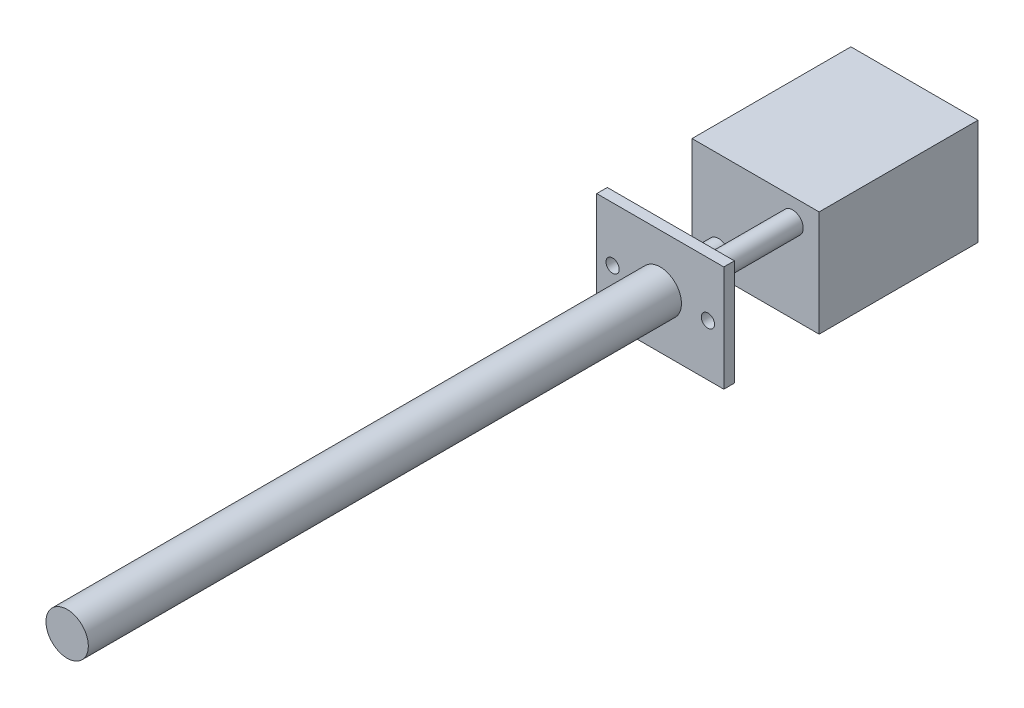
ISO-10303-21;
HEADER;
FILE_DESCRIPTION(('STEP AP214'),'2;1');
FILE_NAME('part.step','',(''),(''),'','','');
FILE_SCHEMA(('AUTOMOTIVE_DESIGN { 1 0 10303 214 1 1 1 1 }'));
ENDSEC;
DATA;
#1=APPLICATION_CONTEXT('core data for automotive mechanical design processes');
#2=APPLICATION_PROTOCOL_DEFINITION('international standard','automotive_design',2000,#1);
#3=PRODUCT_CONTEXT('',#1,'mechanical');
#4=PRODUCT('Part','Part','',(#3));
#5=PRODUCT_RELATED_PRODUCT_CATEGORY('part','',(#4));
#6=PRODUCT_DEFINITION_FORMATION('','',#4);
#7=PRODUCT_DEFINITION_CONTEXT('part definition',#1,'design');
#8=PRODUCT_DEFINITION('design','',#6,#7);
#9=PRODUCT_DEFINITION_SHAPE('','',#8);
#10=(LENGTH_UNIT() NAMED_UNIT(*) SI_UNIT(.MILLI.,.METRE.));
#11=(NAMED_UNIT(*) PLANE_ANGLE_UNIT() SI_UNIT($,.RADIAN.));
#12=(NAMED_UNIT(*) SI_UNIT($,.STERADIAN.) SOLID_ANGLE_UNIT());
#13=UNCERTAINTY_MEASURE_WITH_UNIT(LENGTH_MEASURE(1.E-05),#10,'distance_accuracy_value','');
#14=(GEOMETRIC_REPRESENTATION_CONTEXT(3) GLOBAL_UNCERTAINTY_ASSIGNED_CONTEXT((#13)) GLOBAL_UNIT_ASSIGNED_CONTEXT((#10,
#11,#12)) REPRESENTATION_CONTEXT('',''));
#15=CARTESIAN_POINT('',(0.,0.,0.));
#16=DIRECTION('',(0.,0.,1.));
#17=DIRECTION('',(1.,0.,0.));
#18=AXIS2_PLACEMENT_3D('',#15,#16,#17);
#19=CARTESIAN_POINT('',(6.,-5.,-15.));
#20=DIRECTION('',(1.,0.,0.));
#21=DIRECTION('',(0.,0.,-1.));
#22=AXIS2_PLACEMENT_3D('',#19,#20,#21);
#23=PLANE('',#22);
#24=DIRECTION('',(0.,1.,0.));
#25=VECTOR('',#24,1.);
#26=CARTESIAN_POINT('',(6.,-5.,0.));
#27=LINE('',#26,#25);
#28=CARTESIAN_POINT('',(6.,-5.,0.));
#29=VERTEX_POINT('',#28);
#30=CARTESIAN_POINT('',(6.,5.,0.));
#31=VERTEX_POINT('',#30);
#32=EDGE_CURVE('E168',#29,#31,#27,.T.);
#33=ORIENTED_EDGE('',*,*,#32,.F.);
#34=DIRECTION('',(0.,0.,1.));
#35=VECTOR('',#34,1.);
#36=CARTESIAN_POINT('',(6.,-5.,-15.));
#37=LINE('',#36,#35);
#38=CARTESIAN_POINT('',(6.,-5.,-15.));
#39=VERTEX_POINT('',#38);
#40=EDGE_CURVE('E61',#39,#29,#37,.T.);
#41=ORIENTED_EDGE('',*,*,#40,.F.);
#42=DIRECTION('',(0.,1.,0.));
#43=VECTOR('',#42,1.);
#44=CARTESIAN_POINT('',(6.,-5.,-15.));
#45=LINE('',#44,#43);
#46=CARTESIAN_POINT('',(6.,5.,-15.));
#47=VERTEX_POINT('',#46);
#48=EDGE_CURVE('E169',#39,#47,#45,.T.);
#49=ORIENTED_EDGE('',*,*,#48,.T.);
#50=DIRECTION('',(0.,0.,1.));
#51=VECTOR('',#50,1.);
#52=CARTESIAN_POINT('',(6.,5.,-15.));
#53=LINE('',#52,#51);
#54=EDGE_CURVE('E90',#47,#31,#53,.T.);
#55=ORIENTED_EDGE('',*,*,#54,.T.);
#56=EDGE_LOOP('',(#33,#41,#49,#55));
#57=FACE_BOUND('',#56,.T.);
#58=ADVANCED_FACE('F45',(#57),#23,.T.);
#59=CARTESIAN_POINT('',(-6.,-5.,-15.));
#60=DIRECTION('',(0.,-1.,0.));
#61=DIRECTION('',(0.,0.,-1.));
#62=AXIS2_PLACEMENT_3D('',#59,#60,#61);
#63=PLANE('',#62);
#64=DIRECTION('',(1.,0.,0.));
#65=VECTOR('',#64,1.);
#66=CARTESIAN_POINT('',(-6.,-5.,0.));
#67=LINE('',#66,#65);
#68=CARTESIAN_POINT('',(-6.,-5.,0.));
#69=VERTEX_POINT('',#68);
#70=EDGE_CURVE('E172',#69,#29,#67,.T.);
#71=ORIENTED_EDGE('',*,*,#70,.F.);
#72=DIRECTION('',(0.,0.,1.));
#73=VECTOR('',#72,1.);
#74=CARTESIAN_POINT('',(-6.,-5.,-15.));
#75=LINE('',#74,#73);
#76=CARTESIAN_POINT('',(-6.,-5.,-15.));
#77=VERTEX_POINT('',#76);
#78=EDGE_CURVE('E79',#77,#69,#75,.T.);
#79=ORIENTED_EDGE('',*,*,#78,.F.);
#80=DIRECTION('',(1.,0.,0.));
#81=VECTOR('',#80,1.);
#82=CARTESIAN_POINT('',(-6.,-5.,-15.));
#83=LINE('',#82,#81);
#84=EDGE_CURVE('E176',#77,#39,#83,.T.);
#85=ORIENTED_EDGE('',*,*,#84,.T.);
#86=ORIENTED_EDGE('',*,*,#40,.T.);
#87=EDGE_LOOP('',(#71,#79,#85,#86));
#88=FACE_BOUND('',#87,.T.);
#89=ADVANCED_FACE('F205',(#88),#63,.T.);
#90=CARTESIAN_POINT('',(-6.,-5.,-15.));
#91=DIRECTION('',(-1.,0.,0.));
#92=DIRECTION('',(0.,0.,1.));
#93=AXIS2_PLACEMENT_3D('',#90,#91,#92);
#94=PLANE('',#93);
#95=DIRECTION('',(0.,-1.,0.));
#96=VECTOR('',#95,1.);
#97=CARTESIAN_POINT('',(-6.,-5.,0.));
#98=LINE('',#97,#96);
#99=CARTESIAN_POINT('',(-6.,5.,0.));
#100=VERTEX_POINT('',#99);
#101=EDGE_CURVE('E183',#100,#69,#98,.T.);
#102=ORIENTED_EDGE('',*,*,#101,.F.);
#103=DIRECTION('',(0.,0.,1.));
#104=VECTOR('',#103,1.);
#105=CARTESIAN_POINT('',(-6.,5.,-15.));
#106=LINE('',#105,#104);
#107=CARTESIAN_POINT('',(-6.,5.,-15.));
#108=VERTEX_POINT('',#107);
#109=EDGE_CURVE('E189',#108,#100,#106,.T.);
#110=ORIENTED_EDGE('',*,*,#109,.F.);
#111=DIRECTION('',(0.,-1.,0.));
#112=VECTOR('',#111,1.);
#113=CARTESIAN_POINT('',(-6.,-5.,-15.));
#114=LINE('',#113,#112);
#115=EDGE_CURVE('E174',#108,#77,#114,.T.);
#116=ORIENTED_EDGE('',*,*,#115,.T.);
#117=ORIENTED_EDGE('',*,*,#78,.T.);
#118=EDGE_LOOP('',(#102,#110,#116,#117));
#119=FACE_BOUND('',#118,.T.);
#120=ADVANCED_FACE('F204',(#119),#94,.T.);
#121=CARTESIAN_POINT('',(-6.,5.,-15.));
#122=DIRECTION('',(0.,1.,0.));
#123=DIRECTION('',(0.,0.,1.));
#124=AXIS2_PLACEMENT_3D('',#121,#122,#123);
#125=PLANE('',#124);
#126=DIRECTION('',(-1.,0.,0.));
#127=VECTOR('',#126,1.);
#128=CARTESIAN_POINT('',(-6.,5.,0.));
#129=LINE('',#128,#127);
#130=EDGE_CURVE('E180',#31,#100,#129,.T.);
#131=ORIENTED_EDGE('',*,*,#130,.F.);
#132=ORIENTED_EDGE('',*,*,#54,.F.);
#133=DIRECTION('',(-1.,0.,0.));
#134=VECTOR('',#133,1.);
#135=CARTESIAN_POINT('',(-6.,5.,-15.));
#136=LINE('',#135,#134);
#137=EDGE_CURVE('E171',#47,#108,#136,.T.);
#138=ORIENTED_EDGE('',*,*,#137,.T.);
#139=ORIENTED_EDGE('',*,*,#109,.T.);
#140=EDGE_LOOP('',(#131,#132,#138,#139));
#141=FACE_BOUND('',#140,.T.);
#142=ADVANCED_FACE('F202',(#141),#125,.T.);
#143=CARTESIAN_POINT('',(0.,0.,-15.));
#144=DIRECTION('',(0.,0.,-1.));
#145=DIRECTION('',(-1.,0.,0.));
#146=AXIS2_PLACEMENT_3D('',#143,#144,#145);
#147=PLANE('',#146);
#148=ORIENTED_EDGE('',*,*,#48,.F.);
#149=ORIENTED_EDGE('',*,*,#84,.F.);
#150=ORIENTED_EDGE('',*,*,#115,.F.);
#151=ORIENTED_EDGE('',*,*,#137,.F.);
#152=EDGE_LOOP('',(#148,#149,#150,#151));
#153=FACE_BOUND('',#152,.T.);
#154=ADVANCED_FACE('F199',(#153),#147,.T.);
#155=CARTESIAN_POINT('',(0.,0.,0.));
#156=DIRECTION('',(0.,0.,-1.));
#157=DIRECTION('',(-1.,0.,0.));
#158=AXIS2_PLACEMENT_3D('',#155,#156,#157);
#159=PLANE('',#158);
#160=CARTESIAN_POINT('',(-3.5,-2.91666666666667,0.));
#161=DIRECTION('',(0.,0.,-1.));
#162=DIRECTION('',(-1.,0.,0.));
#163=AXIS2_PLACEMENT_3D('',#160,#161,#162);
#164=CIRCLE('',#163,0.999999999999999);
#165=CARTESIAN_POINT('',(-4.5,-2.91666666666667,0.));
#166=VERTEX_POINT('',#165);
#167=EDGE_CURVE('E11',#166,#166,#164,.F.);
#168=ORIENTED_EDGE('',*,*,#167,.F.);
#169=EDGE_LOOP('',(#168));
#170=FACE_BOUND('',#169,.T.);
#171=CARTESIAN_POINT('',(3.5,2.91666666666667,0.));
#172=DIRECTION('',(0.,0.,-1.));
#173=DIRECTION('',(-1.,0.,0.));
#174=AXIS2_PLACEMENT_3D('',#171,#172,#173);
#175=CIRCLE('',#174,1.);
#176=CARTESIAN_POINT('',(2.5,2.91666666666667,0.));
#177=VERTEX_POINT('',#176);
#178=EDGE_CURVE('E53',#177,#177,#175,.F.);
#179=ORIENTED_EDGE('',*,*,#178,.F.);
#180=EDGE_LOOP('',(#179));
#181=FACE_BOUND('',#180,.T.);
#182=ORIENTED_EDGE('',*,*,#32,.T.);
#183=ORIENTED_EDGE('',*,*,#130,.T.);
#184=ORIENTED_EDGE('',*,*,#101,.T.);
#185=ORIENTED_EDGE('',*,*,#70,.T.);
#186=EDGE_LOOP('',(#182,#183,#184,#185));
#187=FACE_BOUND('',#186,.T.);
#188=ADVANCED_FACE('F196',(#170,#181,#187),#159,.F.);
#189=CARTESIAN_POINT('',(3.5,2.91666666666667,-15.002));
#190=DIRECTION('',(0.,0.,1.));
#191=DIRECTION('',(1.,0.,0.));
#192=AXIS2_PLACEMENT_3D('',#189,#190,#191);
#193=CYLINDRICAL_SURFACE('',#192,1.);
#194=CARTESIAN_POINT('',(3.5,2.91666666666667,8.));
#195=DIRECTION('',(0.,0.,-1.));
#196=DIRECTION('',(-1.,0.,0.));
#197=AXIS2_PLACEMENT_3D('',#194,#195,#196);
#198=CIRCLE('',#197,1.);
#199=CARTESIAN_POINT('',(2.5,2.91666666666667,8.));
#200=VERTEX_POINT('',#199);
#201=EDGE_CURVE('E165',#200,#200,#198,.T.);
#202=ORIENTED_EDGE('',*,*,#201,.T.);
#203=EDGE_LOOP('',(#202));
#204=FACE_BOUND('',#203,.T.);
#205=ORIENTED_EDGE('',*,*,#178,.T.);
#206=EDGE_LOOP('',(#205));
#207=FACE_BOUND('',#206,.T.);
#208=ADVANCED_FACE('F194',(#204,#207),#193,.T.);
#209=CARTESIAN_POINT('',(6.,-5.,8.));
#210=DIRECTION('',(1.,0.,0.));
#211=DIRECTION('',(0.,0.,-1.));
#212=AXIS2_PLACEMENT_3D('',#209,#210,#211);
#213=PLANE('',#212);
#214=DIRECTION('',(0.,1.,0.));
#215=VECTOR('',#214,1.);
#216=CARTESIAN_POINT('',(6.,-5.,9.));
#217=LINE('',#216,#215);
#218=CARTESIAN_POINT('',(6.,-5.,9.));
#219=VERTEX_POINT('',#218);
#220=CARTESIAN_POINT('',(6.,5.,9.));
#221=VERTEX_POINT('',#220);
#222=EDGE_CURVE('E155',#219,#221,#217,.T.);
#223=ORIENTED_EDGE('',*,*,#222,.F.);
#224=DIRECTION('',(0.,0.,1.));
#225=VECTOR('',#224,1.);
#226=CARTESIAN_POINT('',(6.,-5.,8.));
#227=LINE('',#226,#225);
#228=CARTESIAN_POINT('',(6.,-5.,8.));
#229=VERTEX_POINT('',#228);
#230=EDGE_CURVE('E143',#229,#219,#227,.T.);
#231=ORIENTED_EDGE('',*,*,#230,.F.);
#232=DIRECTION('',(0.,1.,0.));
#233=VECTOR('',#232,1.);
#234=CARTESIAN_POINT('',(6.,-5.,8.));
#235=LINE('',#234,#233);
#236=CARTESIAN_POINT('',(6.,5.,8.));
#237=VERTEX_POINT('',#236);
#238=EDGE_CURVE('E137',#229,#237,#235,.T.);
#239=ORIENTED_EDGE('',*,*,#238,.T.);
#240=DIRECTION('',(0.,0.,1.));
#241=VECTOR('',#240,1.);
#242=CARTESIAN_POINT('',(6.,5.,8.));
#243=LINE('',#242,#241);
#244=EDGE_CURVE('E119',#237,#221,#243,.T.);
#245=ORIENTED_EDGE('',*,*,#244,.T.);
#246=EDGE_LOOP('',(#223,#231,#239,#245));
#247=FACE_BOUND('',#246,.T.);
#248=ADVANCED_FACE('F142',(#247),#213,.T.);
#249=CARTESIAN_POINT('',(-6.,-5.,8.));
#250=DIRECTION('',(0.,-1.,0.));
#251=DIRECTION('',(0.,0.,-1.));
#252=AXIS2_PLACEMENT_3D('',#249,#250,#251);
#253=PLANE('',#252);
#254=DIRECTION('',(1.,0.,0.));
#255=VECTOR('',#254,1.);
#256=CARTESIAN_POINT('',(-6.,-5.,9.));
#257=LINE('',#256,#255);
#258=CARTESIAN_POINT('',(-6.,-5.,9.));
#259=VERTEX_POINT('',#258);
#260=EDGE_CURVE('E144',#259,#219,#257,.T.);
#261=ORIENTED_EDGE('',*,*,#260,.F.);
#262=DIRECTION('',(0.,0.,1.));
#263=VECTOR('',#262,1.);
#264=CARTESIAN_POINT('',(-6.,-5.,8.));
#265=LINE('',#264,#263);
#266=CARTESIAN_POINT('',(-6.,-5.,8.));
#267=VERTEX_POINT('',#266);
#268=EDGE_CURVE('E162',#267,#259,#265,.T.);
#269=ORIENTED_EDGE('',*,*,#268,.F.);
#270=DIRECTION('',(1.,0.,0.));
#271=VECTOR('',#270,1.);
#272=CARTESIAN_POINT('',(-6.,-5.,8.));
#273=LINE('',#272,#271);
#274=EDGE_CURVE('E130',#267,#229,#273,.T.);
#275=ORIENTED_EDGE('',*,*,#274,.T.);
#276=ORIENTED_EDGE('',*,*,#230,.T.);
#277=EDGE_LOOP('',(#261,#269,#275,#276));
#278=FACE_BOUND('',#277,.T.);
#279=ADVANCED_FACE('F251',(#278),#253,.T.);
#280=CARTESIAN_POINT('',(-6.,-5.,8.));
#281=DIRECTION('',(-1.,0.,0.));
#282=DIRECTION('',(0.,0.,1.));
#283=AXIS2_PLACEMENT_3D('',#280,#281,#282);
#284=PLANE('',#283);
#285=DIRECTION('',(0.,-1.,0.));
#286=VECTOR('',#285,1.);
#287=CARTESIAN_POINT('',(-6.,-5.,9.));
#288=LINE('',#287,#286);
#289=CARTESIAN_POINT('',(-6.,5.,9.));
#290=VERTEX_POINT('',#289);
#291=EDGE_CURVE('E147',#290,#259,#288,.T.);
#292=ORIENTED_EDGE('',*,*,#291,.F.);
#293=DIRECTION('',(0.,0.,1.));
#294=VECTOR('',#293,1.);
#295=CARTESIAN_POINT('',(-6.,5.,8.));
#296=LINE('',#295,#294);
#297=CARTESIAN_POINT('',(-6.,5.,8.));
#298=VERTEX_POINT('',#297);
#299=EDGE_CURVE('E129',#298,#290,#296,.T.);
#300=ORIENTED_EDGE('',*,*,#299,.F.);
#301=DIRECTION('',(0.,-1.,0.));
#302=VECTOR('',#301,1.);
#303=CARTESIAN_POINT('',(-6.,-5.,8.));
#304=LINE('',#303,#302);
#305=EDGE_CURVE('E140',#298,#267,#304,.T.);
#306=ORIENTED_EDGE('',*,*,#305,.T.);
#307=ORIENTED_EDGE('',*,*,#268,.T.);
#308=EDGE_LOOP('',(#292,#300,#306,#307));
#309=FACE_BOUND('',#308,.T.);
#310=ADVANCED_FACE('F259',(#309),#284,.T.);
#311=CARTESIAN_POINT('',(-6.,5.,8.));
#312=DIRECTION('',(0.,1.,0.));
#313=DIRECTION('',(0.,0.,1.));
#314=AXIS2_PLACEMENT_3D('',#311,#312,#313);
#315=PLANE('',#314);
#316=DIRECTION('',(-1.,0.,0.));
#317=VECTOR('',#316,1.);
#318=CARTESIAN_POINT('',(-6.,5.,9.));
#319=LINE('',#318,#317);
#320=EDGE_CURVE('E124',#221,#290,#319,.T.);
#321=ORIENTED_EDGE('',*,*,#320,.F.);
#322=ORIENTED_EDGE('',*,*,#244,.F.);
#323=DIRECTION('',(-1.,0.,0.));
#324=VECTOR('',#323,1.);
#325=CARTESIAN_POINT('',(-6.,5.,8.));
#326=LINE('',#325,#324);
#327=EDGE_CURVE('E122',#237,#298,#326,.T.);
#328=ORIENTED_EDGE('',*,*,#327,.T.);
#329=ORIENTED_EDGE('',*,*,#299,.T.);
#330=EDGE_LOOP('',(#321,#322,#328,#329));
#331=FACE_BOUND('',#330,.T.);
#332=ADVANCED_FACE('F121',(#331),#315,.T.);
#333=CARTESIAN_POINT('',(0.,0.,8.));
#334=DIRECTION('',(0.,0.,-1.));
#335=DIRECTION('',(-1.,0.,0.));
#336=AXIS2_PLACEMENT_3D('',#333,#334,#335);
#337=PLANE('',#336);
#338=CARTESIAN_POINT('',(-4.5,-0.139522791948174,8.));
#339=DIRECTION('',(0.,0.,-1.));
#340=DIRECTION('',(-1.,0.,0.));
#341=AXIS2_PLACEMENT_3D('',#338,#339,#340);
#342=CIRCLE('',#341,0.624999999999999);
#343=CARTESIAN_POINT('',(-5.125,-0.139522791948174,8.));
#344=VERTEX_POINT('',#343);
#345=EDGE_CURVE('E370',#344,#344,#342,.T.);
#346=ORIENTED_EDGE('',*,*,#345,.F.);
#347=EDGE_LOOP('',(#346));
#348=FACE_BOUND('',#347,.T.);
#349=CARTESIAN_POINT('',(4.5,-0.139522791948174,8.));
#350=DIRECTION('',(0.,0.,-1.));
#351=DIRECTION('',(-1.,0.,0.));
#352=AXIS2_PLACEMENT_3D('',#349,#350,#351);
#353=CIRCLE('',#352,0.624999999999998);
#354=CARTESIAN_POINT('',(3.875,-0.139522791948174,8.));
#355=VERTEX_POINT('',#354);
#356=EDGE_CURVE('E380',#355,#355,#353,.T.);
#357=ORIENTED_EDGE('',*,*,#356,.F.);
#358=EDGE_LOOP('',(#357));
#359=FACE_BOUND('',#358,.T.);
#360=CARTESIAN_POINT('',(-3.5,-2.91666666666667,8.));
#361=DIRECTION('',(0.,0.,-1.));
#362=DIRECTION('',(-1.,0.,0.));
#363=AXIS2_PLACEMENT_3D('',#360,#361,#362);
#364=CIRCLE('',#363,0.999999999999999);
#365=CARTESIAN_POINT('',(-4.5,-2.91666666666667,8.));
#366=VERTEX_POINT('',#365);
#367=EDGE_CURVE('E383',#366,#366,#364,.T.);
#368=ORIENTED_EDGE('',*,*,#367,.F.);
#369=EDGE_LOOP('',(#368));
#370=FACE_BOUND('',#369,.T.);
#371=ORIENTED_EDGE('',*,*,#201,.F.);
#372=EDGE_LOOP('',(#371));
#373=FACE_BOUND('',#372,.T.);
#374=ORIENTED_EDGE('',*,*,#238,.F.);
#375=ORIENTED_EDGE('',*,*,#274,.F.);
#376=ORIENTED_EDGE('',*,*,#305,.F.);
#377=ORIENTED_EDGE('',*,*,#327,.F.);
#378=EDGE_LOOP('',(#374,#375,#376,#377));
#379=FACE_BOUND('',#378,.T.);
#380=ADVANCED_FACE('F135',(#348,#359,#370,#373,#379),#337,.T.);
#381=CARTESIAN_POINT('',(0.,0.,9.));
#382=DIRECTION('',(0.,0.,-1.));
#383=DIRECTION('',(-1.,0.,0.));
#384=AXIS2_PLACEMENT_3D('',#381,#382,#383);
#385=PLANE('',#384);
#386=CARTESIAN_POINT('',(-4.5,-0.139522791948174,9.));
#387=DIRECTION('',(0.,0.,1.));
#388=DIRECTION('',(1.,0.,0.));
#389=AXIS2_PLACEMENT_3D('',#386,#387,#388);
#390=CIRCLE('',#389,0.624999999999999);
#391=CARTESIAN_POINT('',(-3.875,-0.139522791948174,9.));
#392=VERTEX_POINT('',#391);
#393=EDGE_CURVE('E373',#392,#392,#390,.T.);
#394=ORIENTED_EDGE('',*,*,#393,.F.);
#395=EDGE_LOOP('',(#394));
#396=FACE_BOUND('',#395,.T.);
#397=CARTESIAN_POINT('',(4.5,-0.139522791948174,9.));
#398=DIRECTION('',(0.,0.,1.));
#399=DIRECTION('',(1.,0.,0.));
#400=AXIS2_PLACEMENT_3D('',#397,#398,#399);
#401=CIRCLE('',#400,0.624999999999999);
#402=CARTESIAN_POINT('',(5.125,-0.139522791948174,9.));
#403=VERTEX_POINT('',#402);
#404=EDGE_CURVE('E375',#403,#403,#401,.T.);
#405=ORIENTED_EDGE('',*,*,#404,.F.);
#406=EDGE_LOOP('',(#405));
#407=FACE_BOUND('',#406,.T.);
#408=CARTESIAN_POINT('',(0.,0.,9.));
#409=DIRECTION('',(0.,0.,1.));
#410=DIRECTION('',(1.,0.,0.));
#411=AXIS2_PLACEMENT_3D('',#408,#409,#410);
#412=CIRCLE('',#411,2.);
#413=CARTESIAN_POINT('',(2.,0.,9.));
#414=VERTEX_POINT('',#413);
#415=EDGE_CURVE('E150',#414,#414,#412,.T.);
#416=ORIENTED_EDGE('',*,*,#415,.F.);
#417=EDGE_LOOP('',(#416));
#418=FACE_BOUND('',#417,.T.);
#419=ORIENTED_EDGE('',*,*,#222,.T.);
#420=ORIENTED_EDGE('',*,*,#320,.T.);
#421=ORIENTED_EDGE('',*,*,#291,.T.);
#422=ORIENTED_EDGE('',*,*,#260,.T.);
#423=EDGE_LOOP('',(#419,#420,#421,#422));
#424=FACE_BOUND('',#423,.T.);
#425=ADVANCED_FACE('F283',(#396,#407,#418,#424),#385,.F.);
#426=CARTESIAN_POINT('',(0.,0.,65.));
#427=DIRECTION('',(0.,0.,-1.));
#428=DIRECTION('',(-1.,0.,0.));
#429=AXIS2_PLACEMENT_3D('',#426,#427,#428);
#430=CYLINDRICAL_SURFACE('',#429,2.);
#431=CARTESIAN_POINT('',(0.,0.,65.));
#432=DIRECTION('',(0.,0.,1.));
#433=DIRECTION('',(1.,0.,0.));
#434=AXIS2_PLACEMENT_3D('',#431,#432,#433);
#435=CIRCLE('',#434,2.);
#436=CARTESIAN_POINT('',(2.,0.,65.));
#437=VERTEX_POINT('',#436);
#438=EDGE_CURVE('E157',#437,#437,#435,.T.);
#439=ORIENTED_EDGE('',*,*,#438,.F.);
#440=EDGE_LOOP('',(#439));
#441=FACE_BOUND('',#440,.T.);
#442=ORIENTED_EDGE('',*,*,#415,.T.);
#443=EDGE_LOOP('',(#442));
#444=FACE_BOUND('',#443,.T.);
#445=ADVANCED_FACE('F292',(#441,#444),#430,.T.);
#446=CARTESIAN_POINT('',(0.,0.,65.));
#447=DIRECTION('',(0.,0.,1.));
#448=DIRECTION('',(1.,0.,0.));
#449=AXIS2_PLACEMENT_3D('',#446,#447,#448);
#450=PLANE('',#449);
#451=ORIENTED_EDGE('',*,*,#438,.T.);
#452=EDGE_LOOP('',(#451));
#453=FACE_BOUND('',#452,.T.);
#454=ADVANCED_FACE('F302',(#453),#450,.T.);
#455=CARTESIAN_POINT('',(-3.5,-2.91666666666667,-15.002));
#456=DIRECTION('',(0.,0.,1.));
#457=DIRECTION('',(1.,0.,0.));
#458=AXIS2_PLACEMENT_3D('',#455,#456,#457);
#459=CYLINDRICAL_SURFACE('',#458,0.999999999999999);
#460=ORIENTED_EDGE('',*,*,#367,.T.);
#461=EDGE_LOOP('',(#460));
#462=FACE_BOUND('',#461,.T.);
#463=ORIENTED_EDGE('',*,*,#167,.T.);
#464=EDGE_LOOP('',(#463));
#465=FACE_BOUND('',#464,.T.);
#466=ADVANCED_FACE('F311',(#462,#465),#459,.T.);
#467=CARTESIAN_POINT('',(4.5,-0.139522791948174,9.));
#468=DIRECTION('',(0.,0.,1.));
#469=DIRECTION('',(1.,0.,0.));
#470=AXIS2_PLACEMENT_3D('',#467,#468,#469);
#471=CYLINDRICAL_SURFACE('',#470,0.624999999999998);
#472=ORIENTED_EDGE('',*,*,#356,.T.);
#473=EDGE_LOOP('',(#472));
#474=FACE_BOUND('',#473,.T.);
#475=ORIENTED_EDGE('',*,*,#404,.T.);
#476=EDGE_LOOP('',(#475));
#477=FACE_BOUND('',#476,.T.);
#478=ADVANCED_FACE('F327',(#474,#477),#471,.F.);
#479=CARTESIAN_POINT('',(-4.5,-0.139522791948174,9.));
#480=DIRECTION('',(0.,0.,1.));
#481=DIRECTION('',(1.,0.,0.));
#482=AXIS2_PLACEMENT_3D('',#479,#480,#481);
#483=CYLINDRICAL_SURFACE('',#482,0.624999999999999);
#484=ORIENTED_EDGE('',*,*,#345,.T.);
#485=EDGE_LOOP('',(#484));
#486=FACE_BOUND('',#485,.T.);
#487=ORIENTED_EDGE('',*,*,#393,.T.);
#488=EDGE_LOOP('',(#487));
#489=FACE_BOUND('',#488,.T.);
#490=ADVANCED_FACE('F338',(#486,#489),#483,.F.);
#491=CLOSED_SHELL('',(#58,#89,#120,#142,#154,#188,#208,#248,#279,#310,#332,#380,#425,#445,#454,
#466,#478,#490));
#492=MANIFOLD_SOLID_BREP('B2',#491);
#493=ADVANCED_BREP_SHAPE_REPRESENTATION('',(#18,#492),#14);
#494=SHAPE_DEFINITION_REPRESENTATION(#9,#493);
ENDSEC;
END-ISO-10303-21;
